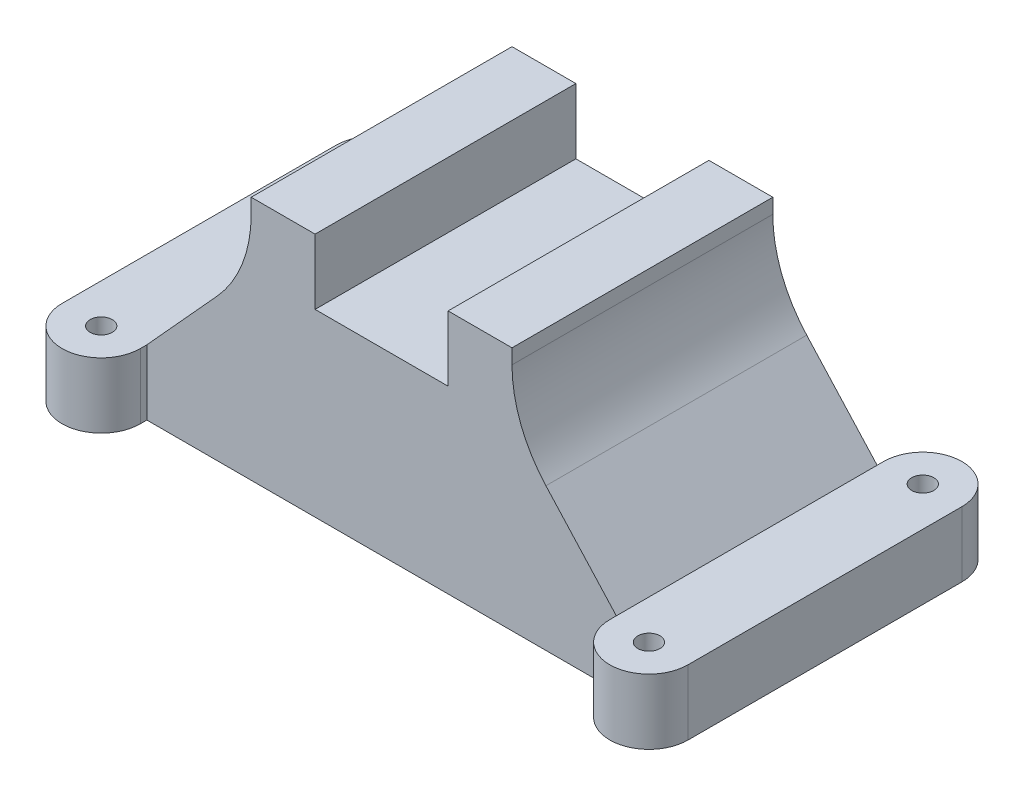
ISO-10303-21;
HEADER;
FILE_DESCRIPTION(('STEP AP214'),'2;1');
FILE_NAME('part.step','',(''),(''),'','','');
FILE_SCHEMA(('AUTOMOTIVE_DESIGN { 1 0 10303 214 1 1 1 1 }'));
ENDSEC;
DATA;
#1=APPLICATION_CONTEXT('core data for automotive mechanical design processes');
#2=APPLICATION_PROTOCOL_DEFINITION('international standard','automotive_design',2000,#1);
#3=PRODUCT_CONTEXT('',#1,'mechanical');
#4=PRODUCT('Part','Part','',(#3));
#5=PRODUCT_RELATED_PRODUCT_CATEGORY('part','',(#4));
#6=PRODUCT_DEFINITION_FORMATION('','',#4);
#7=PRODUCT_DEFINITION_CONTEXT('part definition',#1,'design');
#8=PRODUCT_DEFINITION('design','',#6,#7);
#9=PRODUCT_DEFINITION_SHAPE('','',#8);
#10=(LENGTH_UNIT() NAMED_UNIT(*) SI_UNIT(.MILLI.,.METRE.));
#11=(NAMED_UNIT(*) PLANE_ANGLE_UNIT() SI_UNIT($,.RADIAN.));
#12=(NAMED_UNIT(*) SI_UNIT($,.STERADIAN.) SOLID_ANGLE_UNIT());
#13=UNCERTAINTY_MEASURE_WITH_UNIT(LENGTH_MEASURE(1.E-05),#10,'distance_accuracy_value','');
#14=(GEOMETRIC_REPRESENTATION_CONTEXT(3) GLOBAL_UNCERTAINTY_ASSIGNED_CONTEXT((#13)) GLOBAL_UNIT_ASSIGNED_CONTEXT((#10,
#11,#12)) REPRESENTATION_CONTEXT('',''));
#15=CARTESIAN_POINT('',(0.,0.,0.));
#16=DIRECTION('',(0.,0.,1.));
#17=DIRECTION('',(1.,0.,0.));
#18=AXIS2_PLACEMENT_3D('',#15,#16,#17);
#19=CARTESIAN_POINT('',(-18.,5.,0.));
#20=DIRECTION('',(1.,0.,0.));
#21=DIRECTION('',(0.,0.,-1.));
#22=AXIS2_PLACEMENT_3D('',#19,#20,#21);
#23=PLANE('',#22);
#24=DIRECTION('',(0.,0.,1.));
#25=VECTOR('',#24,1.);
#26=CARTESIAN_POINT('',(-18.,0.,0.));
#27=LINE('',#26,#25);
#28=CARTESIAN_POINT('',(-18.,0.,10.));
#29=VERTEX_POINT('',#28);
#30=CARTESIAN_POINT('',(-18.,0.,10.5));
#31=VERTEX_POINT('',#30);
#32=EDGE_CURVE('E356',#29,#31,#27,.T.);
#33=ORIENTED_EDGE('',*,*,#32,.F.);
#34=DIRECTION('',(0.,-1.,0.));
#35=VECTOR('',#34,1.);
#36=CARTESIAN_POINT('',(-18.,5.,10.));
#37=LINE('',#36,#35);
#38=CARTESIAN_POINT('',(-18.,5.,10.));
#39=VERTEX_POINT('',#38);
#40=EDGE_CURVE('E292',#39,#29,#37,.T.);
#41=ORIENTED_EDGE('',*,*,#40,.F.);
#42=DIRECTION('',(0.,0.,1.));
#43=VECTOR('',#42,1.);
#44=CARTESIAN_POINT('',(-18.,5.,0.));
#45=LINE('',#44,#43);
#46=CARTESIAN_POINT('',(-18.,5.,10.5));
#47=VERTEX_POINT('',#46);
#48=EDGE_CURVE('E338',#39,#47,#45,.T.);
#49=ORIENTED_EDGE('',*,*,#48,.T.);
#50=DIRECTION('',(0.,-1.,0.));
#51=VECTOR('',#50,1.);
#52=CARTESIAN_POINT('',(-18.,5.,10.5));
#53=LINE('',#52,#51);
#54=EDGE_CURVE('E365',#47,#31,#53,.T.);
#55=ORIENTED_EDGE('',*,*,#54,.T.);
#56=EDGE_LOOP('',(#33,#41,#49,#55));
#57=FACE_BOUND('',#56,.T.);
#58=ADVANCED_FACE('F35',(#57),#23,.T.);
#59=CARTESIAN_POINT('',(-24.,5.,0.));
#60=DIRECTION('',(1.,0.,0.));
#61=DIRECTION('',(0.,0.,-1.));
#62=AXIS2_PLACEMENT_3D('',#59,#60,#61);
#63=PLANE('',#62);
#64=DIRECTION('',(0.,0.,1.));
#65=VECTOR('',#64,1.);
#66=CARTESIAN_POINT('',(-24.,0.,0.));
#67=LINE('',#66,#65);
#68=CARTESIAN_POINT('',(-24.,0.,-10.5));
#69=VERTEX_POINT('',#68);
#70=CARTESIAN_POINT('',(-24.,0.,10.5));
#71=VERTEX_POINT('',#70);
#72=EDGE_CURVE('E350',#69,#71,#67,.T.);
#73=ORIENTED_EDGE('',*,*,#72,.T.);
#74=DIRECTION('',(0.,-1.,0.));
#75=VECTOR('',#74,1.);
#76=CARTESIAN_POINT('',(-24.,5.,10.5));
#77=LINE('',#76,#75);
#78=CARTESIAN_POINT('',(-24.,5.,10.5));
#79=VERTEX_POINT('',#78);
#80=EDGE_CURVE('E368',#79,#71,#77,.T.);
#81=ORIENTED_EDGE('',*,*,#80,.F.);
#82=DIRECTION('',(0.,0.,1.));
#83=VECTOR('',#82,1.);
#84=CARTESIAN_POINT('',(-24.,5.,0.));
#85=LINE('',#84,#83);
#86=CARTESIAN_POINT('',(-24.,5.,-10.5));
#87=VERTEX_POINT('',#86);
#88=EDGE_CURVE('E332',#87,#79,#85,.T.);
#89=ORIENTED_EDGE('',*,*,#88,.F.);
#90=DIRECTION('',(0.,-1.,0.));
#91=VECTOR('',#90,1.);
#92=CARTESIAN_POINT('',(-24.,5.,-10.5));
#93=LINE('',#92,#91);
#94=EDGE_CURVE('E344',#87,#69,#93,.T.);
#95=ORIENTED_EDGE('',*,*,#94,.T.);
#96=EDGE_LOOP('',(#73,#81,#89,#95));
#97=FACE_BOUND('',#96,.T.);
#98=ADVANCED_FACE('F442',(#97),#63,.F.);
#99=CARTESIAN_POINT('',(-21.,5.,10.5));
#100=DIRECTION('',(0.,-1.,0.));
#101=DIRECTION('',(0.,0.,-1.));
#102=AXIS2_PLACEMENT_3D('',#99,#100,#101);
#103=CYLINDRICAL_SURFACE('',#102,3.);
#104=CARTESIAN_POINT('',(-21.,0.,10.5));
#105=DIRECTION('',(0.,1.,0.));
#106=DIRECTION('',(0.,0.,1.));
#107=AXIS2_PLACEMENT_3D('',#104,#105,#106);
#108=CIRCLE('',#107,3.);
#109=EDGE_CURVE('E353',#71,#31,#108,.T.);
#110=ORIENTED_EDGE('',*,*,#109,.T.);
#111=ORIENTED_EDGE('',*,*,#54,.F.);
#112=CARTESIAN_POINT('',(-21.,5.,10.5));
#113=DIRECTION('',(0.,1.,0.));
#114=DIRECTION('',(0.,0.,1.));
#115=AXIS2_PLACEMENT_3D('',#112,#113,#114);
#116=CIRCLE('',#115,3.);
#117=EDGE_CURVE('E335',#79,#47,#116,.T.);
#118=ORIENTED_EDGE('',*,*,#117,.F.);
#119=ORIENTED_EDGE('',*,*,#80,.T.);
#120=EDGE_LOOP('',(#110,#111,#118,#119));
#121=FACE_BOUND('',#120,.T.);
#122=ADVANCED_FACE('F447',(#121),#103,.T.);
#123=DIRECTION('',(0.,-1.,0.));
#124=VECTOR('',#123,1.);
#125=CARTESIAN_POINT('',(-18.,5.,-10.));
#126=LINE('',#125,#124);
#127=CARTESIAN_POINT('',(-18.,5.,-10.));
#128=VERTEX_POINT('',#127);
#129=CARTESIAN_POINT('',(-18.,0.,-10.));
#130=VERTEX_POINT('',#129);
#131=EDGE_CURVE('E307',#128,#130,#126,.T.);
#132=ORIENTED_EDGE('',*,*,#131,.T.);
#133=CARTESIAN_POINT('',(-18.,0.,-10.5));
#134=VERTEX_POINT('',#133);
#135=EDGE_CURVE('E357',#134,#130,#27,.T.);
#136=ORIENTED_EDGE('',*,*,#135,.F.);
#137=DIRECTION('',(0.,-1.,0.));
#138=VECTOR('',#137,1.);
#139=CARTESIAN_POINT('',(-18.,5.,-10.5));
#140=LINE('',#139,#138);
#141=CARTESIAN_POINT('',(-18.,5.,-10.5));
#142=VERTEX_POINT('',#141);
#143=EDGE_CURVE('E363',#142,#134,#140,.T.);
#144=ORIENTED_EDGE('',*,*,#143,.F.);
#145=EDGE_CURVE('E339',#142,#128,#45,.T.);
#146=ORIENTED_EDGE('',*,*,#145,.T.);
#147=EDGE_LOOP('',(#132,#136,#144,#146));
#148=FACE_BOUND('',#147,.T.);
#149=ADVANCED_FACE('F419',(#148),#23,.T.);
#150=CARTESIAN_POINT('',(-21.,5.,10.5));
#151=DIRECTION('',(0.,-1.,0.));
#152=DIRECTION('',(0.,0.,-1.));
#153=AXIS2_PLACEMENT_3D('',#150,#151,#152);
#154=CYLINDRICAL_SURFACE('',#153,0.849999999999999);
#155=CARTESIAN_POINT('',(-21.,5.,10.5));
#156=DIRECTION('',(0.,1.,0.));
#157=DIRECTION('',(0.,0.,1.));
#158=AXIS2_PLACEMENT_3D('',#155,#156,#157);
#159=CIRCLE('',#158,0.849999999999999);
#160=CARTESIAN_POINT('',(-21.,5.,11.35));
#161=VERTEX_POINT('',#160);
#162=EDGE_CURVE('E328',#161,#161,#159,.T.);
#163=ORIENTED_EDGE('',*,*,#162,.T.);
#164=EDGE_LOOP('',(#163));
#165=FACE_BOUND('',#164,.T.);
#166=CARTESIAN_POINT('',(-21.,0.,10.5));
#167=DIRECTION('',(0.,1.,0.));
#168=DIRECTION('',(0.,0.,1.));
#169=AXIS2_PLACEMENT_3D('',#166,#167,#168);
#170=CIRCLE('',#169,0.849999999999999);
#171=CARTESIAN_POINT('',(-21.,0.,11.35));
#172=VERTEX_POINT('',#171);
#173=EDGE_CURVE('E347',#172,#172,#170,.T.);
#174=ORIENTED_EDGE('',*,*,#173,.F.);
#175=EDGE_LOOP('',(#174));
#176=FACE_BOUND('',#175,.T.);
#177=ADVANCED_FACE('F453',(#165,#176),#154,.F.);
#178=CARTESIAN_POINT('',(-21.,5.,-10.5));
#179=DIRECTION('',(0.,-1.,0.));
#180=DIRECTION('',(0.,0.,-1.));
#181=AXIS2_PLACEMENT_3D('',#178,#179,#180);
#182=CYLINDRICAL_SURFACE('',#181,0.85);
#183=CARTESIAN_POINT('',(-21.,5.,-10.5));
#184=DIRECTION('',(0.,1.,0.));
#185=DIRECTION('',(0.,0.,1.));
#186=AXIS2_PLACEMENT_3D('',#183,#184,#185);
#187=CIRCLE('',#186,0.85);
#188=CARTESIAN_POINT('',(-21.,5.,-9.65));
#189=VERTEX_POINT('',#188);
#190=EDGE_CURVE('E325',#189,#189,#187,.T.);
#191=ORIENTED_EDGE('',*,*,#190,.T.);
#192=EDGE_LOOP('',(#191));
#193=FACE_BOUND('',#192,.T.);
#194=CARTESIAN_POINT('',(-21.,0.,-10.5));
#195=DIRECTION('',(0.,1.,0.));
#196=DIRECTION('',(0.,0.,1.));
#197=AXIS2_PLACEMENT_3D('',#194,#195,#196);
#198=CIRCLE('',#197,0.85);
#199=CARTESIAN_POINT('',(-21.,0.,-9.65));
#200=VERTEX_POINT('',#199);
#201=EDGE_CURVE('E324',#200,#200,#198,.T.);
#202=ORIENTED_EDGE('',*,*,#201,.F.);
#203=EDGE_LOOP('',(#202));
#204=FACE_BOUND('',#203,.T.);
#205=ADVANCED_FACE('F458',(#193,#204),#182,.F.);
#206=CARTESIAN_POINT('',(-21.,5.,-10.5));
#207=DIRECTION('',(0.,-1.,0.));
#208=DIRECTION('',(0.,0.,-1.));
#209=AXIS2_PLACEMENT_3D('',#206,#207,#208);
#210=CYLINDRICAL_SURFACE('',#209,3.00000000000001);
#211=CARTESIAN_POINT('',(-21.,0.,-10.5));
#212=DIRECTION('',(0.,1.,0.));
#213=DIRECTION('',(0.,0.,1.));
#214=AXIS2_PLACEMENT_3D('',#211,#212,#213);
#215=CIRCLE('',#214,3.00000000000001);
#216=EDGE_CURVE('E329',#134,#69,#215,.T.);
#217=ORIENTED_EDGE('',*,*,#216,.T.);
#218=ORIENTED_EDGE('',*,*,#94,.F.);
#219=CARTESIAN_POINT('',(-21.,5.,-10.5));
#220=DIRECTION('',(0.,1.,0.));
#221=DIRECTION('',(0.,0.,1.));
#222=AXIS2_PLACEMENT_3D('',#219,#220,#221);
#223=CIRCLE('',#222,3.00000000000001);
#224=EDGE_CURVE('E342',#142,#87,#223,.T.);
#225=ORIENTED_EDGE('',*,*,#224,.F.);
#226=ORIENTED_EDGE('',*,*,#143,.T.);
#227=EDGE_LOOP('',(#217,#218,#225,#226));
#228=FACE_BOUND('',#227,.T.);
#229=ADVANCED_FACE('F466',(#228),#210,.T.);
#230=CARTESIAN_POINT('',(0.,5.,0.));
#231=DIRECTION('',(0.,1.,0.));
#232=DIRECTION('',(0.,0.,1.));
#233=AXIS2_PLACEMENT_3D('',#230,#231,#232);
#234=PLANE('',#233);
#235=ORIENTED_EDGE('',*,*,#190,.F.);
#236=EDGE_LOOP('',(#235));
#237=FACE_BOUND('',#236,.T.);
#238=ORIENTED_EDGE('',*,*,#162,.F.);
#239=EDGE_LOOP('',(#238));
#240=FACE_BOUND('',#239,.T.);
#241=ORIENTED_EDGE('',*,*,#88,.T.);
#242=ORIENTED_EDGE('',*,*,#117,.T.);
#243=ORIENTED_EDGE('',*,*,#48,.F.);
#244=DIRECTION('',(0.,0.,-1.));
#245=VECTOR('',#244,1.);
#246=CARTESIAN_POINT('',(-18.,5.,10.));
#247=LINE('',#246,#245);
#248=EDGE_CURVE('E321',#39,#128,#247,.T.);
#249=ORIENTED_EDGE('',*,*,#248,.T.);
#250=ORIENTED_EDGE('',*,*,#145,.F.);
#251=ORIENTED_EDGE('',*,*,#224,.T.);
#252=EDGE_LOOP('',(#241,#242,#243,#249,#250,#251));
#253=FACE_BOUND('',#252,.T.);
#254=ADVANCED_FACE('F423',(#237,#240,#253),#234,.T.);
#255=CARTESIAN_POINT('',(0.,0.,0.));
#256=DIRECTION('',(0.,1.,0.));
#257=DIRECTION('',(0.,0.,1.));
#258=AXIS2_PLACEMENT_3D('',#255,#256,#257);
#259=PLANE('',#258);
#260=ORIENTED_EDGE('',*,*,#201,.T.);
#261=EDGE_LOOP('',(#260));
#262=FACE_BOUND('',#261,.T.);
#263=ORIENTED_EDGE('',*,*,#173,.T.);
#264=EDGE_LOOP('',(#263));
#265=FACE_BOUND('',#264,.T.);
#266=ORIENTED_EDGE('',*,*,#72,.F.);
#267=ORIENTED_EDGE('',*,*,#216,.F.);
#268=ORIENTED_EDGE('',*,*,#135,.T.);
#269=DIRECTION('',(1.,0.,0.));
#270=VECTOR('',#269,1.);
#271=CARTESIAN_POINT('',(-18.,0.,-10.));
#272=LINE('',#271,#270);
#273=CARTESIAN_POINT('',(18.,0.,-10.));
#274=VERTEX_POINT('',#273);
#275=EDGE_CURVE('E310',#130,#274,#272,.T.);
#276=ORIENTED_EDGE('',*,*,#275,.T.);
#277=DIRECTION('',(0.,0.,-1.));
#278=VECTOR('',#277,1.);
#279=CARTESIAN_POINT('',(18.,0.,0.));
#280=LINE('',#279,#278);
#281=CARTESIAN_POINT('',(18.,0.,-10.5));
#282=VERTEX_POINT('',#281);
#283=EDGE_CURVE('E274',#274,#282,#280,.T.);
#284=ORIENTED_EDGE('',*,*,#283,.T.);
#285=CARTESIAN_POINT('',(21.,0.,-10.5));
#286=DIRECTION('',(0.,1.,0.));
#287=DIRECTION('',(0.,0.,1.));
#288=AXIS2_PLACEMENT_3D('',#285,#286,#287);
#289=CIRCLE('',#288,3.);
#290=CARTESIAN_POINT('',(24.,0.,-10.5));
#291=VERTEX_POINT('',#290);
#292=EDGE_CURVE('E271',#291,#282,#289,.T.);
#293=ORIENTED_EDGE('',*,*,#292,.F.);
#294=DIRECTION('',(0.,0.,-1.));
#295=VECTOR('',#294,1.);
#296=CARTESIAN_POINT('',(24.,0.,0.));
#297=LINE('',#296,#295);
#298=CARTESIAN_POINT('',(24.,0.,10.5));
#299=VERTEX_POINT('',#298);
#300=EDGE_CURVE('E268',#299,#291,#297,.T.);
#301=ORIENTED_EDGE('',*,*,#300,.F.);
#302=CARTESIAN_POINT('',(21.,0.,10.5));
#303=DIRECTION('',(0.,1.,0.));
#304=DIRECTION('',(0.,0.,1.));
#305=AXIS2_PLACEMENT_3D('',#302,#303,#304);
#306=CIRCLE('',#305,3.);
#307=CARTESIAN_POINT('',(18.,0.,10.5));
#308=VERTEX_POINT('',#307);
#309=EDGE_CURVE('E247',#308,#299,#306,.T.);
#310=ORIENTED_EDGE('',*,*,#309,.F.);
#311=CARTESIAN_POINT('',(18.,0.,10.));
#312=VERTEX_POINT('',#311);
#313=EDGE_CURVE('E275',#308,#312,#280,.T.);
#314=ORIENTED_EDGE('',*,*,#313,.T.);
#315=DIRECTION('',(1.,0.,0.));
#316=VECTOR('',#315,1.);
#317=CARTESIAN_POINT('',(-18.,0.,10.));
#318=LINE('',#317,#316);
#319=EDGE_CURVE('E296',#29,#312,#318,.T.);
#320=ORIENTED_EDGE('',*,*,#319,.F.);
#321=ORIENTED_EDGE('',*,*,#32,.T.);
#322=ORIENTED_EDGE('',*,*,#109,.F.);
#323=EDGE_LOOP('',(#266,#267,#268,#276,#284,#293,#301,#310,#314,#320,#321,#322));
#324=FACE_BOUND('',#323,.T.);
#325=CARTESIAN_POINT('',(21.,0.,10.5));
#326=DIRECTION('',(0.,1.,0.));
#327=DIRECTION('',(0.,0.,1.));
#328=AXIS2_PLACEMENT_3D('',#325,#326,#327);
#329=CIRCLE('',#328,0.849999999999999);
#330=CARTESIAN_POINT('',(21.,0.,11.35));
#331=VERTEX_POINT('',#330);
#332=EDGE_CURVE('E238',#331,#331,#329,.T.);
#333=ORIENTED_EDGE('',*,*,#332,.T.);
#334=EDGE_LOOP('',(#333));
#335=FACE_BOUND('',#334,.T.);
#336=CARTESIAN_POINT('',(21.,0.,-10.5));
#337=DIRECTION('',(0.,1.,0.));
#338=DIRECTION('',(0.,0.,1.));
#339=AXIS2_PLACEMENT_3D('',#336,#337,#338);
#340=CIRCLE('',#339,0.85);
#341=CARTESIAN_POINT('',(21.,0.,-9.65));
#342=VERTEX_POINT('',#341);
#343=EDGE_CURVE('E265',#342,#342,#340,.T.);
#344=ORIENTED_EDGE('',*,*,#343,.T.);
#345=EDGE_LOOP('',(#344));
#346=FACE_BOUND('',#345,.T.);
#347=ADVANCED_FACE('F412',(#262,#265,#324,#335,#346),#259,.F.);
#348=CARTESIAN_POINT('',(-10.,13.8,10.));
#349=DIRECTION('',(0.739940073395944,-0.672672793996312,0.));
#350=DIRECTION('',(0.672672793996312,0.739940073395944,0.));
#351=AXIS2_PLACEMENT_3D('',#348,#349,#350);
#352=PLANE('',#351);
#353=DIRECTION('',(-0.672672793996312,-0.739940073395944,0.));
#354=VECTOR('',#353,1.);
#355=CARTESIAN_POINT('',(-10.,13.8,10.));
#356=LINE('',#355,#354);
#357=CARTESIAN_POINT('',(-12.6005992660406,10.9393408073554,10.));
#358=VERTEX_POINT('',#357);
#359=EDGE_CURVE('E290',#358,#39,#356,.T.);
#360=ORIENTED_EDGE('',*,*,#359,.F.);
#361=DIRECTION('',(0.,0.,-1.));
#362=VECTOR('',#361,1.);
#363=CARTESIAN_POINT('',(-12.6005992660406,10.9393408073554,10.));
#364=LINE('',#363,#362);
#365=CARTESIAN_POINT('',(-12.6005992660406,10.9393408073554,-10.));
#366=VERTEX_POINT('',#365);
#367=EDGE_CURVE('E376',#358,#366,#364,.T.);
#368=ORIENTED_EDGE('',*,*,#367,.T.);
#369=DIRECTION('',(-0.672672793996312,-0.739940073395944,0.));
#370=VECTOR('',#369,1.);
#371=CARTESIAN_POINT('',(-10.,13.8,-10.));
#372=LINE('',#371,#370);
#373=EDGE_CURVE('E289',#366,#128,#372,.T.);
#374=ORIENTED_EDGE('',*,*,#373,.T.);
#375=ORIENTED_EDGE('',*,*,#248,.F.);
#376=EDGE_LOOP('',(#360,#368,#374,#375));
#377=FACE_BOUND('',#376,.T.);
#378=ADVANCED_FACE('F430',(#377),#352,.F.);
#379=CARTESIAN_POINT('',(18.,5.,10.));
#380=DIRECTION('',(-0.739940073395944,-0.672672793996313,0.));
#381=DIRECTION('',(0.672672793996313,-0.739940073395944,0.));
#382=AXIS2_PLACEMENT_3D('',#379,#380,#381);
#383=PLANE('',#382);
#384=DIRECTION('',(-0.672672793996313,0.739940073395943,0.));
#385=VECTOR('',#384,1.);
#386=CARTESIAN_POINT('',(18.,5.,-10.));
#387=LINE('',#386,#385);
#388=CARTESIAN_POINT('',(18.,5.,-10.));
#389=VERTEX_POINT('',#388);
#390=CARTESIAN_POINT('',(12.6005992660406,10.9393408073554,-10.));
#391=VERTEX_POINT('',#390);
#392=EDGE_CURVE('E315',#389,#391,#387,.T.);
#393=ORIENTED_EDGE('',*,*,#392,.T.);
#394=DIRECTION('',(0.,0.,-1.));
#395=VECTOR('',#394,1.);
#396=CARTESIAN_POINT('',(12.6005992660406,10.9393408073554,10.));
#397=LINE('',#396,#395);
#398=CARTESIAN_POINT('',(12.6005992660406,10.9393408073554,10.));
#399=VERTEX_POINT('',#398);
#400=EDGE_CURVE('E374',#391,#399,#397,.F.);
#401=ORIENTED_EDGE('',*,*,#400,.T.);
#402=DIRECTION('',(-0.672672793996313,0.739940073395943,0.));
#403=VECTOR('',#402,1.);
#404=CARTESIAN_POINT('',(18.,5.,10.));
#405=LINE('',#404,#403);
#406=CARTESIAN_POINT('',(18.,5.,10.));
#407=VERTEX_POINT('',#406);
#408=EDGE_CURVE('E300',#407,#399,#405,.T.);
#409=ORIENTED_EDGE('',*,*,#408,.F.);
#410=DIRECTION('',(0.,0.,-1.));
#411=VECTOR('',#410,1.);
#412=CARTESIAN_POINT('',(18.,5.,10.));
#413=LINE('',#412,#411);
#414=EDGE_CURVE('E305',#407,#389,#413,.T.);
#415=ORIENTED_EDGE('',*,*,#414,.T.);
#416=EDGE_LOOP('',(#393,#401,#409,#415));
#417=FACE_BOUND('',#416,.T.);
#418=ADVANCED_FACE('F395',(#417),#383,.F.);
#419=CARTESIAN_POINT('',(10.,13.8,10.));
#420=DIRECTION('',(0.,-1.,0.));
#421=DIRECTION('',(1.,0.,0.));
#422=AXIS2_PLACEMENT_3D('',#419,#420,#421);
#423=PLANE('',#422);
#424=DIRECTION('',(-1.,0.,0.));
#425=VECTOR('',#424,1.);
#426=CARTESIAN_POINT('',(10.,13.8,10.));
#427=LINE('',#426,#425);
#428=CARTESIAN_POINT('',(5.1,13.8,10.));
#429=VERTEX_POINT('',#428);
#430=CARTESIAN_POINT('',(-5.1,13.8,10.));
#431=VERTEX_POINT('',#430);
#432=EDGE_CURVE('E303',#429,#431,#427,.T.);
#433=ORIENTED_EDGE('',*,*,#432,.F.);
#434=DIRECTION('',(0.,0.,1.));
#435=VECTOR('',#434,1.);
#436=CARTESIAN_POINT('',(5.1,13.8,-10.));
#437=LINE('',#436,#435);
#438=CARTESIAN_POINT('',(5.1,13.8,-10.));
#439=VERTEX_POINT('',#438);
#440=EDGE_CURVE('E195',#439,#429,#437,.T.);
#441=ORIENTED_EDGE('',*,*,#440,.F.);
#442=DIRECTION('',(-1.,0.,0.));
#443=VECTOR('',#442,1.);
#444=CARTESIAN_POINT('',(10.,13.8,-10.));
#445=LINE('',#444,#443);
#446=CARTESIAN_POINT('',(-5.1,13.8,-10.));
#447=VERTEX_POINT('',#446);
#448=EDGE_CURVE('E293',#439,#447,#445,.T.);
#449=ORIENTED_EDGE('',*,*,#448,.T.);
#450=DIRECTION('',(0.,0.,1.));
#451=VECTOR('',#450,1.);
#452=CARTESIAN_POINT('',(-5.1,13.8,-10.));
#453=LINE('',#452,#451);
#454=EDGE_CURVE('E235',#447,#431,#453,.T.);
#455=ORIENTED_EDGE('',*,*,#454,.T.);
#456=EDGE_LOOP('',(#433,#441,#449,#455));
#457=FACE_BOUND('',#456,.T.);
#458=ADVANCED_FACE('F491',(#457),#423,.F.);
#459=CARTESIAN_POINT('',(0.,0.,10.));
#460=DIRECTION('',(0.,0.,-1.));
#461=DIRECTION('',(-1.,0.,0.));
#462=AXIS2_PLACEMENT_3D('',#459,#460,#461);
#463=PLANE('',#462);
#464=DIRECTION('',(0.,-1.,0.));
#465=VECTOR('',#464,1.);
#466=CARTESIAN_POINT('',(-10.,13.8,10.));
#467=LINE('',#466,#465);
#468=CARTESIAN_POINT('',(-10.,18.8,10.));
#469=VERTEX_POINT('',#468);
#470=CARTESIAN_POINT('',(-10.,17.6660687473185,10.));
#471=VERTEX_POINT('',#470);
#472=EDGE_CURVE('E225',#469,#471,#467,.T.);
#473=ORIENTED_EDGE('',*,*,#472,.T.);
#474=CARTESIAN_POINT('',(-20.,17.6660687473185,10.));
#475=DIRECTION('',(0.,0.,-1.));
#476=DIRECTION('',(-1.,0.,0.));
#477=AXIS2_PLACEMENT_3D('',#474,#475,#476);
#478=CIRCLE('',#477,10.);
#479=EDGE_CURVE('E11',#471,#358,#478,.T.);
#480=ORIENTED_EDGE('',*,*,#479,.T.);
#481=ORIENTED_EDGE('',*,*,#359,.T.);
#482=ORIENTED_EDGE('',*,*,#40,.T.);
#483=ORIENTED_EDGE('',*,*,#319,.T.);
#484=DIRECTION('',(0.,1.,0.));
#485=VECTOR('',#484,1.);
#486=CARTESIAN_POINT('',(18.,0.,10.));
#487=LINE('',#486,#485);
#488=EDGE_CURVE('E298',#312,#407,#487,.T.);
#489=ORIENTED_EDGE('',*,*,#488,.T.);
#490=ORIENTED_EDGE('',*,*,#408,.T.);
#491=CARTESIAN_POINT('',(20.,17.6660687473185,10.));
#492=DIRECTION('',(0.,0.,-1.));
#493=DIRECTION('',(-1.,0.,0.));
#494=AXIS2_PLACEMENT_3D('',#491,#492,#493);
#495=CIRCLE('',#494,10.);
#496=CARTESIAN_POINT('',(10.,17.6660687473185,10.));
#497=VERTEX_POINT('',#496);
#498=EDGE_CURVE('E382',#399,#497,#495,.T.);
#499=ORIENTED_EDGE('',*,*,#498,.T.);
#500=DIRECTION('',(0.,1.,0.));
#501=VECTOR('',#500,1.);
#502=CARTESIAN_POINT('',(10.,13.8,10.));
#503=LINE('',#502,#501);
#504=CARTESIAN_POINT('',(10.,18.8,10.));
#505=VERTEX_POINT('',#504);
#506=EDGE_CURVE('E204',#497,#505,#503,.T.);
#507=ORIENTED_EDGE('',*,*,#506,.T.);
#508=DIRECTION('',(-1.,0.,0.));
#509=VECTOR('',#508,1.);
#510=CARTESIAN_POINT('',(10.,18.8,10.));
#511=LINE('',#510,#509);
#512=CARTESIAN_POINT('',(5.1,18.8,10.));
#513=VERTEX_POINT('',#512);
#514=EDGE_CURVE('E189',#505,#513,#511,.T.);
#515=ORIENTED_EDGE('',*,*,#514,.T.);
#516=DIRECTION('',(0.,-1.,0.));
#517=VECTOR('',#516,1.);
#518=CARTESIAN_POINT('',(5.1,18.8,10.));
#519=LINE('',#518,#517);
#520=EDGE_CURVE('E200',#513,#429,#519,.T.);
#521=ORIENTED_EDGE('',*,*,#520,.T.);
#522=ORIENTED_EDGE('',*,*,#432,.T.);
#523=DIRECTION('',(0.,1.,0.));
#524=VECTOR('',#523,1.);
#525=CARTESIAN_POINT('',(-5.1,18.8,10.));
#526=LINE('',#525,#524);
#527=CARTESIAN_POINT('',(-5.1,18.8,10.));
#528=VERTEX_POINT('',#527);
#529=EDGE_CURVE('E218',#431,#528,#526,.T.);
#530=ORIENTED_EDGE('',*,*,#529,.T.);
#531=DIRECTION('',(-1.,0.,0.));
#532=VECTOR('',#531,1.);
#533=CARTESIAN_POINT('',(-10.,18.8,10.));
#534=LINE('',#533,#532);
#535=EDGE_CURVE('E222',#528,#469,#534,.T.);
#536=ORIENTED_EDGE('',*,*,#535,.T.);
#537=EDGE_LOOP('',(#473,#480,#481,#482,#483,#489,#490,#499,#507,#515,#521,#522,#530,#536));
#538=FACE_BOUND('',#537,.T.);
#539=ADVANCED_FACE('F206',(#538),#463,.F.);
#540=CARTESIAN_POINT('',(0.,0.,-10.));
#541=DIRECTION('',(0.,0.,-1.));
#542=DIRECTION('',(-1.,0.,0.));
#543=AXIS2_PLACEMENT_3D('',#540,#541,#542);
#544=PLANE('',#543);
#545=ORIENTED_EDGE('',*,*,#373,.F.);
#546=CARTESIAN_POINT('',(-20.,17.6660687473185,-10.));
#547=DIRECTION('',(0.,0.,-1.));
#548=DIRECTION('',(-1.,0.,0.));
#549=AXIS2_PLACEMENT_3D('',#546,#547,#548);
#550=CIRCLE('',#549,10.);
#551=CARTESIAN_POINT('',(-10.,17.6660687473185,-10.));
#552=VERTEX_POINT('',#551);
#553=EDGE_CURVE('E43',#366,#552,#550,.F.);
#554=ORIENTED_EDGE('',*,*,#553,.T.);
#555=DIRECTION('',(0.,-1.,0.));
#556=VECTOR('',#555,1.);
#557=CARTESIAN_POINT('',(-10.,13.8,-10.));
#558=LINE('',#557,#556);
#559=CARTESIAN_POINT('',(-10.,18.8,-10.));
#560=VERTEX_POINT('',#559);
#561=EDGE_CURVE('E233',#560,#552,#558,.T.);
#562=ORIENTED_EDGE('',*,*,#561,.F.);
#563=DIRECTION('',(-1.,0.,0.));
#564=VECTOR('',#563,1.);
#565=CARTESIAN_POINT('',(-10.,18.8,-10.));
#566=LINE('',#565,#564);
#567=CARTESIAN_POINT('',(-5.1,18.8,-10.));
#568=VERTEX_POINT('',#567);
#569=EDGE_CURVE('E230',#568,#560,#566,.T.);
#570=ORIENTED_EDGE('',*,*,#569,.F.);
#571=DIRECTION('',(0.,1.,0.));
#572=VECTOR('',#571,1.);
#573=CARTESIAN_POINT('',(-5.1,18.8,-10.));
#574=LINE('',#573,#572);
#575=EDGE_CURVE('E227',#447,#568,#574,.T.);
#576=ORIENTED_EDGE('',*,*,#575,.F.);
#577=ORIENTED_EDGE('',*,*,#448,.F.);
#578=DIRECTION('',(0.,-1.,0.));
#579=VECTOR('',#578,1.);
#580=CARTESIAN_POINT('',(5.1,18.8,-10.));
#581=LINE('',#580,#579);
#582=CARTESIAN_POINT('',(5.1,18.8,-10.));
#583=VERTEX_POINT('',#582);
#584=EDGE_CURVE('E213',#583,#439,#581,.T.);
#585=ORIENTED_EDGE('',*,*,#584,.F.);
#586=DIRECTION('',(-1.,0.,0.));
#587=VECTOR('',#586,1.);
#588=CARTESIAN_POINT('',(10.,18.8,-10.));
#589=LINE('',#588,#587);
#590=CARTESIAN_POINT('',(10.,18.8,-10.));
#591=VERTEX_POINT('',#590);
#592=EDGE_CURVE('E191',#591,#583,#589,.T.);
#593=ORIENTED_EDGE('',*,*,#592,.F.);
#594=DIRECTION('',(0.,1.,0.));
#595=VECTOR('',#594,1.);
#596=CARTESIAN_POINT('',(10.,13.8,-10.));
#597=LINE('',#596,#595);
#598=CARTESIAN_POINT('',(10.,17.6660687473185,-10.));
#599=VERTEX_POINT('',#598);
#600=EDGE_CURVE('E196',#599,#591,#597,.T.);
#601=ORIENTED_EDGE('',*,*,#600,.F.);
#602=CARTESIAN_POINT('',(20.,17.6660687473185,-10.));
#603=DIRECTION('',(0.,0.,-1.));
#604=DIRECTION('',(-1.,0.,0.));
#605=AXIS2_PLACEMENT_3D('',#602,#603,#604);
#606=CIRCLE('',#605,10.);
#607=EDGE_CURVE('E380',#599,#391,#606,.F.);
#608=ORIENTED_EDGE('',*,*,#607,.T.);
#609=ORIENTED_EDGE('',*,*,#392,.F.);
#610=DIRECTION('',(0.,1.,0.));
#611=VECTOR('',#610,1.);
#612=CARTESIAN_POINT('',(18.,0.,-10.));
#613=LINE('',#612,#611);
#614=EDGE_CURVE('E312',#274,#389,#613,.T.);
#615=ORIENTED_EDGE('',*,*,#614,.F.);
#616=ORIENTED_EDGE('',*,*,#275,.F.);
#617=ORIENTED_EDGE('',*,*,#131,.F.);
#618=EDGE_LOOP('',(#545,#554,#562,#570,#576,#577,#585,#593,#601,#608,#609,#615,#616,#617));
#619=FACE_BOUND('',#618,.T.);
#620=ADVANCED_FACE('F392',(#619),#544,.T.);
#621=CARTESIAN_POINT('',(18.,5.,0.));
#622=DIRECTION('',(-1.,0.,0.));
#623=DIRECTION('',(0.,0.,1.));
#624=AXIS2_PLACEMENT_3D('',#621,#622,#623);
#625=PLANE('',#624);
#626=ORIENTED_EDGE('',*,*,#488,.F.);
#627=ORIENTED_EDGE('',*,*,#313,.F.);
#628=DIRECTION('',(0.,-1.,0.));
#629=VECTOR('',#628,1.);
#630=CARTESIAN_POINT('',(18.,5.,10.5));
#631=LINE('',#630,#629);
#632=CARTESIAN_POINT('',(18.,5.,10.5));
#633=VERTEX_POINT('',#632);
#634=EDGE_CURVE('E281',#633,#308,#631,.T.);
#635=ORIENTED_EDGE('',*,*,#634,.F.);
#636=DIRECTION('',(0.,0.,-1.));
#637=VECTOR('',#636,1.);
#638=CARTESIAN_POINT('',(18.,5.,0.));
#639=LINE('',#638,#637);
#640=EDGE_CURVE('E257',#633,#407,#639,.T.);
#641=ORIENTED_EDGE('',*,*,#640,.T.);
#642=EDGE_LOOP('',(#626,#627,#635,#641));
#643=FACE_BOUND('',#642,.T.);
#644=ADVANCED_FACE('F497',(#643),#625,.T.);
#645=CARTESIAN_POINT('',(24.,5.,0.));
#646=DIRECTION('',(-1.,0.,0.));
#647=DIRECTION('',(0.,0.,1.));
#648=AXIS2_PLACEMENT_3D('',#645,#646,#647);
#649=PLANE('',#648);
#650=ORIENTED_EDGE('',*,*,#300,.T.);
#651=DIRECTION('',(0.,-1.,0.));
#652=VECTOR('',#651,1.);
#653=CARTESIAN_POINT('',(24.,5.,-10.5));
#654=LINE('',#653,#652);
#655=CARTESIAN_POINT('',(24.,5.,-10.5));
#656=VERTEX_POINT('',#655);
#657=EDGE_CURVE('E286',#656,#291,#654,.T.);
#658=ORIENTED_EDGE('',*,*,#657,.F.);
#659=DIRECTION('',(0.,0.,-1.));
#660=VECTOR('',#659,1.);
#661=CARTESIAN_POINT('',(24.,5.,0.));
#662=LINE('',#661,#660);
#663=CARTESIAN_POINT('',(24.,5.,10.5));
#664=VERTEX_POINT('',#663);
#665=EDGE_CURVE('E250',#664,#656,#662,.T.);
#666=ORIENTED_EDGE('',*,*,#665,.F.);
#667=DIRECTION('',(0.,-1.,0.));
#668=VECTOR('',#667,1.);
#669=CARTESIAN_POINT('',(24.,5.,10.5));
#670=LINE('',#669,#668);
#671=EDGE_CURVE('E262',#664,#299,#670,.T.);
#672=ORIENTED_EDGE('',*,*,#671,.T.);
#673=EDGE_LOOP('',(#650,#658,#666,#672));
#674=FACE_BOUND('',#673,.T.);
#675=ADVANCED_FACE('F509',(#674),#649,.F.);
#676=CARTESIAN_POINT('',(21.,5.,-10.5));
#677=DIRECTION('',(0.,-1.,0.));
#678=DIRECTION('',(0.,0.,-1.));
#679=AXIS2_PLACEMENT_3D('',#676,#677,#678);
#680=CYLINDRICAL_SURFACE('',#679,3.);
#681=ORIENTED_EDGE('',*,*,#292,.T.);
#682=DIRECTION('',(0.,-1.,0.));
#683=VECTOR('',#682,1.);
#684=CARTESIAN_POINT('',(18.,5.,-10.5));
#685=LINE('',#684,#683);
#686=CARTESIAN_POINT('',(18.,5.,-10.5));
#687=VERTEX_POINT('',#686);
#688=EDGE_CURVE('E283',#687,#282,#685,.T.);
#689=ORIENTED_EDGE('',*,*,#688,.F.);
#690=CARTESIAN_POINT('',(21.,5.,-10.5));
#691=DIRECTION('',(0.,1.,0.));
#692=DIRECTION('',(0.,0.,1.));
#693=AXIS2_PLACEMENT_3D('',#690,#691,#692);
#694=CIRCLE('',#693,3.);
#695=EDGE_CURVE('E253',#656,#687,#694,.T.);
#696=ORIENTED_EDGE('',*,*,#695,.F.);
#697=ORIENTED_EDGE('',*,*,#657,.T.);
#698=EDGE_LOOP('',(#681,#689,#696,#697));
#699=FACE_BOUND('',#698,.T.);
#700=ADVANCED_FACE('F408',(#699),#680,.T.);
#701=ORIENTED_EDGE('',*,*,#283,.F.);
#702=ORIENTED_EDGE('',*,*,#614,.T.);
#703=EDGE_CURVE('E256',#389,#687,#639,.T.);
#704=ORIENTED_EDGE('',*,*,#703,.T.);
#705=ORIENTED_EDGE('',*,*,#688,.T.);
#706=EDGE_LOOP('',(#701,#702,#704,#705));
#707=FACE_BOUND('',#706,.T.);
#708=ADVANCED_FACE('F402',(#707),#625,.T.);
#709=CARTESIAN_POINT('',(21.,5.,-10.5));
#710=DIRECTION('',(0.,-1.,0.));
#711=DIRECTION('',(0.,0.,-1.));
#712=AXIS2_PLACEMENT_3D('',#709,#710,#711);
#713=CYLINDRICAL_SURFACE('',#712,0.85);
#714=CARTESIAN_POINT('',(21.,5.,-10.5));
#715=DIRECTION('',(0.,1.,0.));
#716=DIRECTION('',(0.,0.,1.));
#717=AXIS2_PLACEMENT_3D('',#714,#715,#716);
#718=CIRCLE('',#717,0.85);
#719=CARTESIAN_POINT('',(21.,5.,-9.65));
#720=VERTEX_POINT('',#719);
#721=EDGE_CURVE('E246',#720,#720,#718,.T.);
#722=ORIENTED_EDGE('',*,*,#721,.T.);
#723=EDGE_LOOP('',(#722));
#724=FACE_BOUND('',#723,.T.);
#725=ORIENTED_EDGE('',*,*,#343,.F.);
#726=EDGE_LOOP('',(#725));
#727=FACE_BOUND('',#726,.T.);
#728=ADVANCED_FACE('F504',(#724,#727),#713,.F.);
#729=CARTESIAN_POINT('',(21.,5.,10.5));
#730=DIRECTION('',(0.,-1.,0.));
#731=DIRECTION('',(0.,0.,-1.));
#732=AXIS2_PLACEMENT_3D('',#729,#730,#731);
#733=CYLINDRICAL_SURFACE('',#732,0.849999999999999);
#734=CARTESIAN_POINT('',(21.,5.,10.5));
#735=DIRECTION('',(0.,1.,0.));
#736=DIRECTION('',(0.,0.,1.));
#737=AXIS2_PLACEMENT_3D('',#734,#735,#736);
#738=CIRCLE('',#737,0.849999999999999);
#739=CARTESIAN_POINT('',(21.,5.,11.35));
#740=VERTEX_POINT('',#739);
#741=EDGE_CURVE('E243',#740,#740,#738,.T.);
#742=ORIENTED_EDGE('',*,*,#741,.T.);
#743=EDGE_LOOP('',(#742));
#744=FACE_BOUND('',#743,.T.);
#745=ORIENTED_EDGE('',*,*,#332,.F.);
#746=EDGE_LOOP('',(#745));
#747=FACE_BOUND('',#746,.T.);
#748=ADVANCED_FACE('F500',(#744,#747),#733,.F.);
#749=CARTESIAN_POINT('',(21.,5.,10.5));
#750=DIRECTION('',(0.,-1.,0.));
#751=DIRECTION('',(0.,0.,-1.));
#752=AXIS2_PLACEMENT_3D('',#749,#750,#751);
#753=CYLINDRICAL_SURFACE('',#752,3.);
#754=ORIENTED_EDGE('',*,*,#309,.T.);
#755=ORIENTED_EDGE('',*,*,#671,.F.);
#756=CARTESIAN_POINT('',(21.,5.,10.5));
#757=DIRECTION('',(0.,1.,0.));
#758=DIRECTION('',(0.,0.,1.));
#759=AXIS2_PLACEMENT_3D('',#756,#757,#758);
#760=CIRCLE('',#759,3.);
#761=EDGE_CURVE('E260',#633,#664,#760,.T.);
#762=ORIENTED_EDGE('',*,*,#761,.F.);
#763=ORIENTED_EDGE('',*,*,#634,.T.);
#764=EDGE_LOOP('',(#754,#755,#762,#763));
#765=FACE_BOUND('',#764,.T.);
#766=ADVANCED_FACE('F503',(#765),#753,.T.);
#767=CARTESIAN_POINT('',(0.,5.,0.));
#768=DIRECTION('',(0.,1.,0.));
#769=DIRECTION('',(0.,0.,1.));
#770=AXIS2_PLACEMENT_3D('',#767,#768,#769);
#771=PLANE('',#770);
#772=ORIENTED_EDGE('',*,*,#741,.F.);
#773=EDGE_LOOP('',(#772));
#774=FACE_BOUND('',#773,.T.);
#775=ORIENTED_EDGE('',*,*,#721,.F.);
#776=EDGE_LOOP('',(#775));
#777=FACE_BOUND('',#776,.T.);
#778=ORIENTED_EDGE('',*,*,#665,.T.);
#779=ORIENTED_EDGE('',*,*,#695,.T.);
#780=ORIENTED_EDGE('',*,*,#703,.F.);
#781=ORIENTED_EDGE('',*,*,#414,.F.);
#782=ORIENTED_EDGE('',*,*,#640,.F.);
#783=ORIENTED_EDGE('',*,*,#761,.T.);
#784=EDGE_LOOP('',(#778,#779,#780,#781,#782,#783));
#785=FACE_BOUND('',#784,.T.);
#786=ADVANCED_FACE('F403',(#774,#777,#785),#771,.T.);
#787=CARTESIAN_POINT('',(-10.,13.8,-10.));
#788=DIRECTION('',(-1.,0.,0.));
#789=DIRECTION('',(0.,0.,1.));
#790=AXIS2_PLACEMENT_3D('',#787,#788,#789);
#791=PLANE('',#790);
#792=ORIENTED_EDGE('',*,*,#561,.T.);
#793=DIRECTION('',(0.,0.,-1.));
#794=VECTOR('',#793,1.);
#795=CARTESIAN_POINT('',(-10.,17.6660687473185,-10.));
#796=LINE('',#795,#794);
#797=EDGE_CURVE('E56',#552,#471,#796,.F.);
#798=ORIENTED_EDGE('',*,*,#797,.T.);
#799=ORIENTED_EDGE('',*,*,#472,.F.);
#800=DIRECTION('',(0.,0.,1.));
#801=VECTOR('',#800,1.);
#802=CARTESIAN_POINT('',(-10.,18.8,-10.));
#803=LINE('',#802,#801);
#804=EDGE_CURVE('E236',#560,#469,#803,.T.);
#805=ORIENTED_EDGE('',*,*,#804,.F.);
#806=EDGE_LOOP('',(#792,#798,#799,#805));
#807=FACE_BOUND('',#806,.T.);
#808=ADVANCED_FACE('F522',(#807),#791,.T.);
#809=CARTESIAN_POINT('',(-10.,18.8,-10.));
#810=DIRECTION('',(0.,1.,0.));
#811=DIRECTION('',(0.,0.,1.));
#812=AXIS2_PLACEMENT_3D('',#809,#810,#811);
#813=PLANE('',#812);
#814=ORIENTED_EDGE('',*,*,#804,.T.);
#815=ORIENTED_EDGE('',*,*,#535,.F.);
#816=DIRECTION('',(0.,0.,1.));
#817=VECTOR('',#816,1.);
#818=CARTESIAN_POINT('',(-5.1,18.8,-10.));
#819=LINE('',#818,#817);
#820=EDGE_CURVE('E239',#568,#528,#819,.T.);
#821=ORIENTED_EDGE('',*,*,#820,.F.);
#822=ORIENTED_EDGE('',*,*,#569,.T.);
#823=EDGE_LOOP('',(#814,#815,#821,#822));
#824=FACE_BOUND('',#823,.T.);
#825=ADVANCED_FACE('F527',(#824),#813,.T.);
#826=CARTESIAN_POINT('',(-5.1,18.8,-10.));
#827=DIRECTION('',(1.,0.,0.));
#828=DIRECTION('',(0.,1.,0.));
#829=AXIS2_PLACEMENT_3D('',#826,#827,#828);
#830=PLANE('',#829);
#831=ORIENTED_EDGE('',*,*,#820,.T.);
#832=ORIENTED_EDGE('',*,*,#529,.F.);
#833=ORIENTED_EDGE('',*,*,#454,.F.);
#834=ORIENTED_EDGE('',*,*,#575,.T.);
#835=EDGE_LOOP('',(#831,#832,#833,#834));
#836=FACE_BOUND('',#835,.T.);
#837=ADVANCED_FACE('F524',(#836),#830,.T.);
#838=CARTESIAN_POINT('',(10.,18.8,-10.));
#839=DIRECTION('',(0.,1.,0.));
#840=DIRECTION('',(0.,0.,1.));
#841=AXIS2_PLACEMENT_3D('',#838,#839,#840);
#842=PLANE('',#841);
#843=DIRECTION('',(0.,0.,1.));
#844=VECTOR('',#843,1.);
#845=CARTESIAN_POINT('',(5.1,18.8,-10.));
#846=LINE('',#845,#844);
#847=EDGE_CURVE('E184',#583,#513,#846,.T.);
#848=ORIENTED_EDGE('',*,*,#847,.T.);
#849=ORIENTED_EDGE('',*,*,#514,.F.);
#850=DIRECTION('',(0.,0.,1.));
#851=VECTOR('',#850,1.);
#852=CARTESIAN_POINT('',(10.,18.8,-10.));
#853=LINE('',#852,#851);
#854=EDGE_CURVE('E216',#591,#505,#853,.T.);
#855=ORIENTED_EDGE('',*,*,#854,.F.);
#856=ORIENTED_EDGE('',*,*,#592,.T.);
#857=EDGE_LOOP('',(#848,#849,#855,#856));
#858=FACE_BOUND('',#857,.T.);
#859=ADVANCED_FACE('F186',(#858),#842,.T.);
#860=CARTESIAN_POINT('',(10.,13.8,-10.));
#861=DIRECTION('',(1.,0.,0.));
#862=DIRECTION('',(0.,0.,-1.));
#863=AXIS2_PLACEMENT_3D('',#860,#861,#862);
#864=PLANE('',#863);
#865=ORIENTED_EDGE('',*,*,#506,.F.);
#866=DIRECTION('',(0.,0.,-1.));
#867=VECTOR('',#866,1.);
#868=CARTESIAN_POINT('',(10.,17.6660687473185,-10.));
#869=LINE('',#868,#867);
#870=EDGE_CURVE('E371',#497,#599,#869,.T.);
#871=ORIENTED_EDGE('',*,*,#870,.T.);
#872=ORIENTED_EDGE('',*,*,#600,.T.);
#873=ORIENTED_EDGE('',*,*,#854,.T.);
#874=EDGE_LOOP('',(#865,#871,#872,#873));
#875=FACE_BOUND('',#874,.T.);
#876=ADVANCED_FACE('F389',(#875),#864,.T.);
#877=CARTESIAN_POINT('',(5.1,18.8,-10.));
#878=DIRECTION('',(-1.,0.,0.));
#879=DIRECTION('',(0.,-1.,0.));
#880=AXIS2_PLACEMENT_3D('',#877,#878,#879);
#881=PLANE('',#880);
#882=ORIENTED_EDGE('',*,*,#440,.T.);
#883=ORIENTED_EDGE('',*,*,#520,.F.);
#884=ORIENTED_EDGE('',*,*,#847,.F.);
#885=ORIENTED_EDGE('',*,*,#584,.T.);
#886=EDGE_LOOP('',(#882,#883,#884,#885));
#887=FACE_BOUND('',#886,.T.);
#888=ADVANCED_FACE('F201',(#887),#881,.T.);
#889=CARTESIAN_POINT('',(20.,17.6660687473185,-10.));
#890=DIRECTION('',(0.,0.,-1.));
#891=DIRECTION('',(-1.,0.,0.));
#892=AXIS2_PLACEMENT_3D('',#889,#890,#891);
#893=CYLINDRICAL_SURFACE('',#892,10.);
#894=ORIENTED_EDGE('',*,*,#498,.F.);
#895=ORIENTED_EDGE('',*,*,#400,.F.);
#896=ORIENTED_EDGE('',*,*,#607,.F.);
#897=ORIENTED_EDGE('',*,*,#870,.F.);
#898=EDGE_LOOP('',(#894,#895,#896,#897));
#899=FACE_BOUND('',#898,.T.);
#900=ADVANCED_FACE('F391',(#899),#893,.F.);
#901=CARTESIAN_POINT('',(-20.,17.6660687473185,10.));
#902=DIRECTION('',(0.,0.,-1.));
#903=DIRECTION('',(-1.,0.,0.));
#904=AXIS2_PLACEMENT_3D('',#901,#902,#903);
#905=CYLINDRICAL_SURFACE('',#904,10.);
#906=ORIENTED_EDGE('',*,*,#479,.F.);
#907=ORIENTED_EDGE('',*,*,#797,.F.);
#908=ORIENTED_EDGE('',*,*,#553,.F.);
#909=ORIENTED_EDGE('',*,*,#367,.F.);
#910=EDGE_LOOP('',(#906,#907,#908,#909));
#911=FACE_BOUND('',#910,.T.);
#912=ADVANCED_FACE('F37',(#911),#905,.F.);
#913=CLOSED_SHELL('',(#58,#98,#122,#149,#177,#205,#229,#254,#347,#378,#418,#458,#539,#620,#644,
#675,#700,#708,#728,#748,#766,#786,#808,#825,#837,#859,#876,#888,#900,#912));
#914=MANIFOLD_SOLID_BREP('B2',#913);
#915=ADVANCED_BREP_SHAPE_REPRESENTATION('',(#18,#914),#14);
#916=SHAPE_DEFINITION_REPRESENTATION(#9,#915);
ENDSEC;
END-ISO-10303-21;
